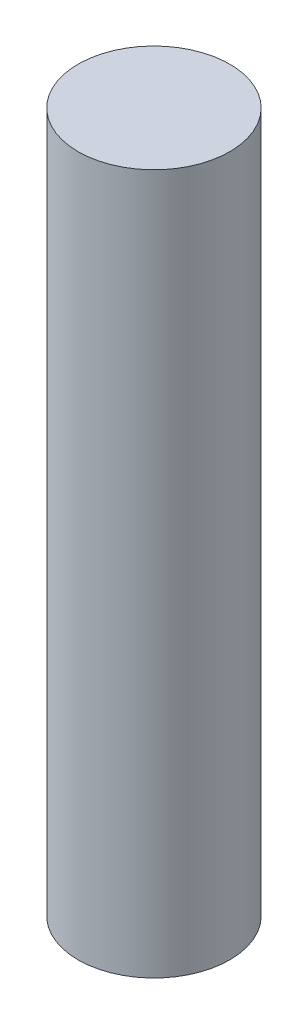
ISO-10303-21;
HEADER;
FILE_DESCRIPTION(('STEP AP214'),'2;1');
FILE_NAME('part.step','',(''),(''),'','','');
FILE_SCHEMA(('AUTOMOTIVE_DESIGN { 1 0 10303 214 1 1 1 1 }'));
ENDSEC;
DATA;
#1=APPLICATION_CONTEXT('core data for automotive mechanical design processes');
#2=APPLICATION_PROTOCOL_DEFINITION('international standard','automotive_design',2000,#1);
#3=PRODUCT_CONTEXT('',#1,'mechanical');
#4=PRODUCT('Part','Part','',(#3));
#5=PRODUCT_RELATED_PRODUCT_CATEGORY('part','',(#4));
#6=PRODUCT_DEFINITION_FORMATION('','',#4);
#7=PRODUCT_DEFINITION_CONTEXT('part definition',#1,'design');
#8=PRODUCT_DEFINITION('design','',#6,#7);
#9=PRODUCT_DEFINITION_SHAPE('','',#8);
#10=(LENGTH_UNIT() NAMED_UNIT(*) SI_UNIT(.MILLI.,.METRE.));
#11=(NAMED_UNIT(*) PLANE_ANGLE_UNIT() SI_UNIT($,.RADIAN.));
#12=(NAMED_UNIT(*) SI_UNIT($,.STERADIAN.) SOLID_ANGLE_UNIT());
#13=UNCERTAINTY_MEASURE_WITH_UNIT(LENGTH_MEASURE(1.E-05),#10,'distance_accuracy_value','');
#14=(GEOMETRIC_REPRESENTATION_CONTEXT(3) GLOBAL_UNCERTAINTY_ASSIGNED_CONTEXT((#13)) GLOBAL_UNIT_ASSIGNED_CONTEXT((#10,
#11,#12)) REPRESENTATION_CONTEXT('',''));
#15=CARTESIAN_POINT('',(0.,0.,0.));
#16=DIRECTION('',(0.,0.,1.));
#17=DIRECTION('',(1.,0.,0.));
#18=AXIS2_PLACEMENT_3D('',#15,#16,#17);
#19=CARTESIAN_POINT('',(0.,300.,0.));
#20=DIRECTION('',(0.,-1.,0.));
#21=DIRECTION('',(0.,0.,-1.));
#22=AXIS2_PLACEMENT_3D('',#19,#20,#21);
#23=CYLINDRICAL_SURFACE('',#22,32.5);
#24=DIRECTION('',(0.,-1.,0.));
#25=VECTOR('',#24,1.);
#26=CARTESIAN_POINT('',(-31.7372021451167,300.,-7.));
#27=LINE('',#26,#25);
#28=CARTESIAN_POINT('',(-31.7372021451167,229.6,-6.99999999999999));
#29=VERTEX_POINT('',#28);
#30=CARTESIAN_POINT('',(-31.7372021451167,273.6,-7.));
#31=VERTEX_POINT('',#30);
#32=EDGE_CURVE('E11',#29,#31,#27,.F.);
#33=ORIENTED_EDGE('',*,*,#32,.T.);
#34=CARTESIAN_POINT('',(0.,273.6,0.));
#35=DIRECTION('',(0.,1.,0.));
#36=DIRECTION('',(0.,0.,1.));
#37=AXIS2_PLACEMENT_3D('',#34,#35,#36);
#38=CIRCLE('',#37,32.5);
#39=CARTESIAN_POINT('',(-31.7372021451167,273.6,7.));
#40=VERTEX_POINT('',#39);
#41=EDGE_CURVE('E110',#31,#40,#38,.T.);
#42=ORIENTED_EDGE('',*,*,#41,.T.);
#43=DIRECTION('',(0.,-1.,0.));
#44=VECTOR('',#43,1.);
#45=CARTESIAN_POINT('',(-31.7372021451167,300.,7.));
#46=LINE('',#45,#44);
#47=CARTESIAN_POINT('',(-31.7372021451167,229.6,7.00000000000001));
#48=VERTEX_POINT('',#47);
#49=EDGE_CURVE('E44',#40,#48,#46,.T.);
#50=ORIENTED_EDGE('',*,*,#49,.T.);
#51=CARTESIAN_POINT('',(0.,229.6,0.));
#52=DIRECTION('',(0.,-1.,0.));
#53=DIRECTION('',(0.,0.,-1.));
#54=AXIS2_PLACEMENT_3D('',#51,#52,#53);
#55=CIRCLE('',#54,32.5);
#56=EDGE_CURVE('E59',#48,#29,#55,.T.);
#57=ORIENTED_EDGE('',*,*,#56,.T.);
#58=EDGE_LOOP('',(#33,#42,#50,#57));
#59=FACE_BOUND('',#58,.T.);
#60=CARTESIAN_POINT('',(0.,300.,0.));
#61=DIRECTION('',(0.,1.,0.));
#62=DIRECTION('',(0.,0.,1.));
#63=AXIS2_PLACEMENT_3D('',#60,#61,#62);
#64=CIRCLE('',#63,32.5);
#65=CARTESIAN_POINT('',(0.,300.,32.5));
#66=VERTEX_POINT('',#65);
#67=EDGE_CURVE('E107',#66,#66,#64,.T.);
#68=ORIENTED_EDGE('',*,*,#67,.F.);
#69=EDGE_LOOP('',(#68));
#70=FACE_BOUND('',#69,.T.);
#71=CARTESIAN_POINT('',(0.,0.,0.));
#72=DIRECTION('',(0.,1.,0.));
#73=DIRECTION('',(0.,0.,1.));
#74=AXIS2_PLACEMENT_3D('',#71,#72,#73);
#75=CIRCLE('',#74,32.5);
#76=CARTESIAN_POINT('',(0.,0.,32.5));
#77=VERTEX_POINT('',#76);
#78=EDGE_CURVE('E103',#77,#77,#75,.T.);
#79=ORIENTED_EDGE('',*,*,#78,.T.);
#80=EDGE_LOOP('',(#79));
#81=FACE_BOUND('',#80,.T.);
#82=ADVANCED_FACE('F37',(#59,#70,#81),#23,.T.);
#83=CARTESIAN_POINT('',(0.,300.,0.));
#84=DIRECTION('',(0.,1.,0.));
#85=DIRECTION('',(0.,0.,1.));
#86=AXIS2_PLACEMENT_3D('',#83,#84,#85);
#87=PLANE('',#86);
#88=ORIENTED_EDGE('',*,*,#67,.T.);
#89=EDGE_LOOP('',(#88));
#90=FACE_BOUND('',#89,.T.);
#91=ADVANCED_FACE('F130',(#90),#87,.T.);
#92=CARTESIAN_POINT('',(0.,0.,0.));
#93=DIRECTION('',(0.,1.,0.));
#94=DIRECTION('',(0.,0.,1.));
#95=AXIS2_PLACEMENT_3D('',#92,#93,#94);
#96=PLANE('',#95);
#97=ORIENTED_EDGE('',*,*,#78,.F.);
#98=EDGE_LOOP('',(#97));
#99=FACE_BOUND('',#98,.T.);
#100=ADVANCED_FACE('F126',(#99),#96,.F.);
#101=CARTESIAN_POINT('',(-22.5,273.6,7.));
#102=DIRECTION('',(0.,0.,1.));
#103=DIRECTION('',(0.,-1.,0.));
#104=AXIS2_PLACEMENT_3D('',#101,#102,#103);
#105=PLANE('',#104);
#106=DIRECTION('',(-1.,0.,0.));
#107=VECTOR('',#106,1.);
#108=CARTESIAN_POINT('',(-22.5,273.6,7.));
#109=LINE('',#108,#107);
#110=CARTESIAN_POINT('',(-22.5,273.6,7.));
#111=VERTEX_POINT('',#110);
#112=EDGE_CURVE('E51',#111,#40,#109,.T.);
#113=ORIENTED_EDGE('',*,*,#112,.F.);
#114=DIRECTION('',(0.,1.,0.));
#115=VECTOR('',#114,1.);
#116=CARTESIAN_POINT('',(-22.5,273.6,7.));
#117=LINE('',#116,#115);
#118=CARTESIAN_POINT('',(-22.5,229.6,7.00000000000001));
#119=VERTEX_POINT('',#118);
#120=EDGE_CURVE('E79',#119,#111,#117,.T.);
#121=ORIENTED_EDGE('',*,*,#120,.F.);
#122=DIRECTION('',(-1.,0.,0.));
#123=VECTOR('',#122,1.);
#124=CARTESIAN_POINT('',(-22.5,229.6,7.00000000000001));
#125=LINE('',#124,#123);
#126=EDGE_CURVE('E101',#119,#48,#125,.T.);
#127=ORIENTED_EDGE('',*,*,#126,.T.);
#128=ORIENTED_EDGE('',*,*,#49,.F.);
#129=EDGE_LOOP('',(#113,#121,#127,#128));
#130=FACE_BOUND('',#129,.T.);
#131=ADVANCED_FACE('F77',(#130),#105,.F.);
#132=CARTESIAN_POINT('',(-22.5,229.6,-6.99999999999999));
#133=DIRECTION('',(0.,-1.,0.));
#134=DIRECTION('',(0.,0.,-1.));
#135=AXIS2_PLACEMENT_3D('',#132,#133,#134);
#136=PLANE('',#135);
#137=ORIENTED_EDGE('',*,*,#126,.F.);
#138=DIRECTION('',(0.,0.,1.));
#139=VECTOR('',#138,1.);
#140=CARTESIAN_POINT('',(-22.5,229.6,-6.99999999999999));
#141=LINE('',#140,#139);
#142=CARTESIAN_POINT('',(-22.5,229.6,-6.99999999999999));
#143=VERTEX_POINT('',#142);
#144=EDGE_CURVE('E84',#143,#119,#141,.T.);
#145=ORIENTED_EDGE('',*,*,#144,.F.);
#146=DIRECTION('',(-1.,0.,0.));
#147=VECTOR('',#146,1.);
#148=CARTESIAN_POINT('',(-22.5,229.6,-6.99999999999999));
#149=LINE('',#148,#147);
#150=EDGE_CURVE('E104',#143,#29,#149,.T.);
#151=ORIENTED_EDGE('',*,*,#150,.T.);
#152=ORIENTED_EDGE('',*,*,#56,.F.);
#153=EDGE_LOOP('',(#137,#145,#151,#152));
#154=FACE_BOUND('',#153,.T.);
#155=ADVANCED_FACE('F118',(#154),#136,.F.);
#156=CARTESIAN_POINT('',(-22.5,273.6,-7.));
#157=DIRECTION('',(0.,0.,-1.));
#158=DIRECTION('',(0.,1.,0.));
#159=AXIS2_PLACEMENT_3D('',#156,#157,#158);
#160=PLANE('',#159);
#161=ORIENTED_EDGE('',*,*,#150,.F.);
#162=DIRECTION('',(0.,-1.,0.));
#163=VECTOR('',#162,1.);
#164=CARTESIAN_POINT('',(-22.5,273.6,-7.));
#165=LINE('',#164,#163);
#166=CARTESIAN_POINT('',(-22.5,273.6,-7.));
#167=VERTEX_POINT('',#166);
#168=EDGE_CURVE('E93',#167,#143,#165,.T.);
#169=ORIENTED_EDGE('',*,*,#168,.F.);
#170=DIRECTION('',(-1.,0.,0.));
#171=VECTOR('',#170,1.);
#172=CARTESIAN_POINT('',(-22.5,273.6,-7.));
#173=LINE('',#172,#171);
#174=EDGE_CURVE('E83',#167,#31,#173,.T.);
#175=ORIENTED_EDGE('',*,*,#174,.T.);
#176=ORIENTED_EDGE('',*,*,#32,.F.);
#177=EDGE_LOOP('',(#161,#169,#175,#176));
#178=FACE_BOUND('',#177,.T.);
#179=ADVANCED_FACE('F117',(#178),#160,.F.);
#180=CARTESIAN_POINT('',(-22.5,273.6,-7.));
#181=DIRECTION('',(0.,1.,0.));
#182=DIRECTION('',(0.,0.,1.));
#183=AXIS2_PLACEMENT_3D('',#180,#181,#182);
#184=PLANE('',#183);
#185=ORIENTED_EDGE('',*,*,#174,.F.);
#186=DIRECTION('',(0.,0.,-1.));
#187=VECTOR('',#186,1.);
#188=CARTESIAN_POINT('',(-22.5,273.6,-7.));
#189=LINE('',#188,#187);
#190=EDGE_CURVE('E87',#111,#167,#189,.T.);
#191=ORIENTED_EDGE('',*,*,#190,.F.);
#192=ORIENTED_EDGE('',*,*,#112,.T.);
#193=ORIENTED_EDGE('',*,*,#41,.F.);
#194=EDGE_LOOP('',(#185,#191,#192,#193));
#195=FACE_BOUND('',#194,.T.);
#196=ADVANCED_FACE('F88',(#195),#184,.F.);
#197=CARTESIAN_POINT('',(-22.5,0.,0.));
#198=DIRECTION('',(-1.,0.,0.));
#199=DIRECTION('',(0.,0.,1.));
#200=AXIS2_PLACEMENT_3D('',#197,#198,#199);
#201=PLANE('',#200);
#202=ORIENTED_EDGE('',*,*,#120,.T.);
#203=ORIENTED_EDGE('',*,*,#190,.T.);
#204=ORIENTED_EDGE('',*,*,#168,.T.);
#205=ORIENTED_EDGE('',*,*,#144,.T.);
#206=EDGE_LOOP('',(#202,#203,#204,#205));
#207=FACE_BOUND('',#206,.T.);
#208=ADVANCED_FACE('F95',(#207),#201,.T.);
#209=CLOSED_SHELL('',(#82,#91,#100,#131,#155,#179,#196,#208));
#210=MANIFOLD_SOLID_BREP('B2',#209);
#211=ADVANCED_BREP_SHAPE_REPRESENTATION('',(#18,#210),#14);
#212=SHAPE_DEFINITION_REPRESENTATION(#9,#211);
ENDSEC;
END-ISO-10303-21;
